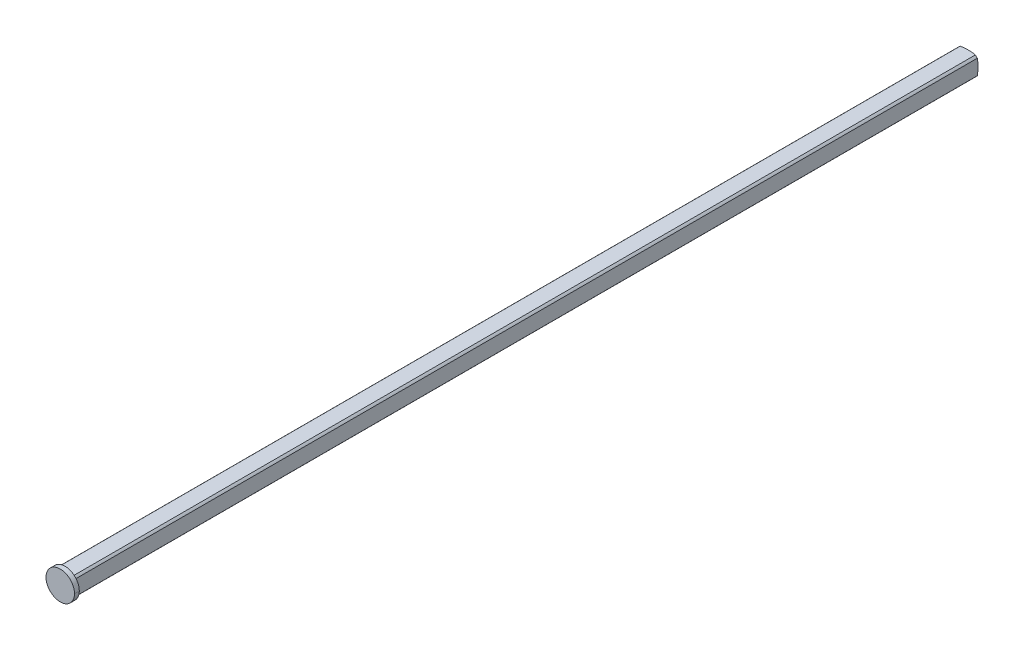
ISO-10303-21;
HEADER;
FILE_DESCRIPTION(('STEP AP214'),'2;1');
FILE_NAME('part.step','',(''),(''),'','','');
FILE_SCHEMA(('AUTOMOTIVE_DESIGN { 1 0 10303 214 1 1 1 1 }'));
ENDSEC;
DATA;
#1=APPLICATION_CONTEXT('core data for automotive mechanical design processes');
#2=APPLICATION_PROTOCOL_DEFINITION('international standard','automotive_design',2000,#1);
#3=PRODUCT_CONTEXT('',#1,'mechanical');
#4=PRODUCT('Part','Part','',(#3));
#5=PRODUCT_RELATED_PRODUCT_CATEGORY('part','',(#4));
#6=PRODUCT_DEFINITION_FORMATION('','',#4);
#7=PRODUCT_DEFINITION_CONTEXT('part definition',#1,'design');
#8=PRODUCT_DEFINITION('design','',#6,#7);
#9=PRODUCT_DEFINITION_SHAPE('','',#8);
#10=(LENGTH_UNIT() NAMED_UNIT(*) SI_UNIT(.MILLI.,.METRE.));
#11=(NAMED_UNIT(*) PLANE_ANGLE_UNIT() SI_UNIT($,.RADIAN.));
#12=(NAMED_UNIT(*) SI_UNIT($,.STERADIAN.) SOLID_ANGLE_UNIT());
#13=UNCERTAINTY_MEASURE_WITH_UNIT(LENGTH_MEASURE(1.E-05),#10,'distance_accuracy_value','');
#14=(GEOMETRIC_REPRESENTATION_CONTEXT(3) GLOBAL_UNCERTAINTY_ASSIGNED_CONTEXT((#13)) GLOBAL_UNIT_ASSIGNED_CONTEXT((#10,
#11,#12)) REPRESENTATION_CONTEXT('',''));
#15=CARTESIAN_POINT('',(0.,0.,0.));
#16=DIRECTION('',(0.,0.,1.));
#17=DIRECTION('',(1.,0.,0.));
#18=AXIS2_PLACEMENT_3D('',#15,#16,#17);
#19=CARTESIAN_POINT('',(0.,0.,-150.622));
#20=DIRECTION('',(0.,0.,1.));
#21=DIRECTION('',(1.,0.,0.));
#22=AXIS2_PLACEMENT_3D('',#19,#20,#21);
#23=CYLINDRICAL_SURFACE('',#22,2.032);
#24=DIRECTION('',(0.,0.,-1.));
#25=VECTOR('',#24,1.);
#26=CARTESIAN_POINT('',(1.5875,1.26841150657032,-150.622));
#27=LINE('',#26,#25);
#28=CARTESIAN_POINT('',(1.5875,1.26841150657032,0.));
#29=VERTEX_POINT('',#28);
#30=CARTESIAN_POINT('',(1.5875,1.26841150657033,-150.470919142098));
#31=VERTEX_POINT('',#30);
#32=EDGE_CURVE('P0_E292',#29,#31,#27,.T.);
#33=ORIENTED_EDGE('',*,*,#32,.T.);
#34=CARTESIAN_POINT('',(0.,0.,-150.470919142098));
#35=DIRECTION('',(0.,0.,1.));
#36=DIRECTION('',(1.,0.,0.));
#37=AXIS2_PLACEMENT_3D('',#34,#35,#36);
#38=CIRCLE('',#37,2.032);
#39=CARTESIAN_POINT('',(1.26841150657032,1.5875,-150.470919142098));
#40=VERTEX_POINT('',#39);
#41=EDGE_CURVE('P0_E370',#31,#40,#38,.T.);
#42=ORIENTED_EDGE('',*,*,#41,.T.);
#43=DIRECTION('',(0.,0.,1.));
#44=VECTOR('',#43,1.);
#45=CARTESIAN_POINT('',(1.26841150657032,1.5875,-150.622));
#46=LINE('',#45,#44);
#47=CARTESIAN_POINT('',(1.26841150657032,1.5875,0.));
#48=VERTEX_POINT('',#47);
#49=EDGE_CURVE('P0_E358',#40,#48,#46,.T.);
#50=ORIENTED_EDGE('',*,*,#49,.T.);
#51=CARTESIAN_POINT('',(0.,0.,0.));
#52=DIRECTION('',(0.,0.,1.));
#53=DIRECTION('',(1.,0.,0.));
#54=AXIS2_PLACEMENT_3D('',#51,#52,#53);
#55=CIRCLE('',#54,2.032);
#56=EDGE_CURVE('P0_E344',#29,#48,#55,.T.);
#57=ORIENTED_EDGE('',*,*,#56,.F.);
#58=EDGE_LOOP('',(#33,#42,#50,#57));
#59=FACE_BOUND('',#58,.T.);
#60=ADVANCED_FACE('P0_F17',(#59),#23,.T.);
#61=CARTESIAN_POINT('',(0.,0.,-150.622));
#62=DIRECTION('',(0.,0.,1.));
#63=DIRECTION('',(1.,0.,0.));
#64=AXIS2_PLACEMENT_3D('',#61,#62,#63);
#65=CYLINDRICAL_SURFACE('',#64,2.032);
#66=DIRECTION('',(0.,0.,1.));
#67=VECTOR('',#66,1.);
#68=CARTESIAN_POINT('',(-1.5875,1.26841150657032,-150.622));
#69=LINE('',#68,#67);
#70=CARTESIAN_POINT('',(-1.5875,1.26841150657032,-150.470919142098));
#71=VERTEX_POINT('',#70);
#72=CARTESIAN_POINT('',(-1.5875,1.26841150657032,0.));
#73=VERTEX_POINT('',#72);
#74=EDGE_CURVE('P0_E144',#71,#73,#69,.T.);
#75=ORIENTED_EDGE('',*,*,#74,.T.);
#76=CARTESIAN_POINT('',(0.,0.,0.));
#77=DIRECTION('',(0.,0.,1.));
#78=DIRECTION('',(1.,0.,0.));
#79=AXIS2_PLACEMENT_3D('',#76,#77,#78);
#80=CIRCLE('',#79,2.032);
#81=CARTESIAN_POINT('',(-1.26841150657032,1.5875,0.));
#82=VERTEX_POINT('',#81);
#83=EDGE_CURVE('P0_E43',#82,#73,#80,.T.);
#84=ORIENTED_EDGE('',*,*,#83,.F.);
#85=DIRECTION('',(0.,0.,-1.));
#86=VECTOR('',#85,1.);
#87=CARTESIAN_POINT('',(-1.26841150657032,1.5875,-150.622));
#88=LINE('',#87,#86);
#89=CARTESIAN_POINT('',(-1.26841150657033,1.5875,-150.470919142098));
#90=VERTEX_POINT('',#89);
#91=EDGE_CURVE('P0_E327',#82,#90,#88,.T.);
#92=ORIENTED_EDGE('',*,*,#91,.T.);
#93=CARTESIAN_POINT('',(0.,0.,-150.470919142098));
#94=DIRECTION('',(0.,0.,1.));
#95=DIRECTION('',(1.,0.,0.));
#96=AXIS2_PLACEMENT_3D('',#93,#94,#95);
#97=CIRCLE('',#96,2.032);
#98=EDGE_CURVE('P0_E274',#90,#71,#97,.T.);
#99=ORIENTED_EDGE('',*,*,#98,.T.);
#100=EDGE_LOOP('',(#75,#84,#92,#99));
#101=FACE_BOUND('',#100,.T.);
#102=ADVANCED_FACE('P0_F424',(#101),#65,.T.);
#103=CARTESIAN_POINT('',(0.,0.,-150.622));
#104=DIRECTION('',(0.,0.,1.));
#105=DIRECTION('',(1.,0.,0.));
#106=AXIS2_PLACEMENT_3D('',#103,#104,#105);
#107=CYLINDRICAL_SURFACE('',#106,2.032);
#108=DIRECTION('',(0.,0.,-1.));
#109=VECTOR('',#108,1.);
#110=CARTESIAN_POINT('',(-1.5875,-1.26841150657032,-150.622));
#111=LINE('',#110,#109);
#112=CARTESIAN_POINT('',(-1.5875,-1.26841150657032,0.));
#113=VERTEX_POINT('',#112);
#114=CARTESIAN_POINT('',(-1.5875,-1.26841150657033,-150.470919142098));
#115=VERTEX_POINT('',#114);
#116=EDGE_CURVE('P0_E117',#113,#115,#111,.T.);
#117=ORIENTED_EDGE('',*,*,#116,.T.);
#118=CARTESIAN_POINT('',(0.,0.,-150.470919142098));
#119=DIRECTION('',(0.,0.,1.));
#120=DIRECTION('',(1.,0.,0.));
#121=AXIS2_PLACEMENT_3D('',#118,#119,#120);
#122=CIRCLE('',#121,2.032);
#123=CARTESIAN_POINT('',(-1.26841150657032,-1.5875,-150.470919142098));
#124=VERTEX_POINT('',#123);
#125=EDGE_CURVE('P0_E11',#115,#124,#122,.T.);
#126=ORIENTED_EDGE('',*,*,#125,.T.);
#127=DIRECTION('',(0.,0.,1.));
#128=VECTOR('',#127,1.);
#129=CARTESIAN_POINT('',(-1.26841150657032,-1.5875,-150.622));
#130=LINE('',#129,#128);
#131=CARTESIAN_POINT('',(-1.26841150657032,-1.5875,0.));
#132=VERTEX_POINT('',#131);
#133=EDGE_CURVE('P0_E120',#124,#132,#130,.T.);
#134=ORIENTED_EDGE('',*,*,#133,.T.);
#135=CARTESIAN_POINT('',(0.,0.,0.));
#136=DIRECTION('',(0.,0.,1.));
#137=DIRECTION('',(1.,0.,0.));
#138=AXIS2_PLACEMENT_3D('',#135,#136,#137);
#139=CIRCLE('',#138,2.032);
#140=EDGE_CURVE('P0_E111',#113,#132,#139,.T.);
#141=ORIENTED_EDGE('',*,*,#140,.F.);
#142=EDGE_LOOP('',(#117,#126,#134,#141));
#143=FACE_BOUND('',#142,.T.);
#144=ADVANCED_FACE('P0_F19',(#143),#107,.T.);
#145=CARTESIAN_POINT('',(0.,0.,-150.622));
#146=DIRECTION('',(0.,0.,1.));
#147=DIRECTION('',(1.,0.,0.));
#148=AXIS2_PLACEMENT_3D('',#145,#146,#147);
#149=CYLINDRICAL_SURFACE('',#148,2.032);
#150=DIRECTION('',(0.,0.,-1.));
#151=VECTOR('',#150,1.);
#152=CARTESIAN_POINT('',(1.26841150657032,-1.5875,-150.622));
#153=LINE('',#152,#151);
#154=CARTESIAN_POINT('',(1.26841150657032,-1.5875,0.));
#155=VERTEX_POINT('',#154);
#156=CARTESIAN_POINT('',(1.26841150657033,-1.5875,-150.470919142098));
#157=VERTEX_POINT('',#156);
#158=EDGE_CURVE('P0_E237',#155,#157,#153,.T.);
#159=ORIENTED_EDGE('',*,*,#158,.T.);
#160=CARTESIAN_POINT('',(0.,0.,-150.470919142098));
#161=DIRECTION('',(0.,0.,1.));
#162=DIRECTION('',(1.,0.,0.));
#163=AXIS2_PLACEMENT_3D('',#160,#161,#162);
#164=CIRCLE('',#163,2.032);
#165=CARTESIAN_POINT('',(1.5875,-1.26841150657032,-150.470919142098));
#166=VERTEX_POINT('',#165);
#167=EDGE_CURVE('P0_E29',#157,#166,#164,.T.);
#168=ORIENTED_EDGE('',*,*,#167,.T.);
#169=DIRECTION('',(0.,0.,1.));
#170=VECTOR('',#169,1.);
#171=CARTESIAN_POINT('',(1.5875,-1.26841150657032,-150.622));
#172=LINE('',#171,#170);
#173=CARTESIAN_POINT('',(1.5875,-1.26841150657032,0.));
#174=VERTEX_POINT('',#173);
#175=EDGE_CURVE('P0_E284',#166,#174,#172,.T.);
#176=ORIENTED_EDGE('',*,*,#175,.T.);
#177=CARTESIAN_POINT('',(0.,0.,0.));
#178=DIRECTION('',(0.,0.,1.));
#179=DIRECTION('',(1.,0.,0.));
#180=AXIS2_PLACEMENT_3D('',#177,#178,#179);
#181=CIRCLE('',#180,2.032);
#182=EDGE_CURVE('P0_E123',#155,#174,#181,.T.);
#183=ORIENTED_EDGE('',*,*,#182,.F.);
#184=EDGE_LOOP('',(#159,#168,#176,#183));
#185=FACE_BOUND('',#184,.T.);
#186=ADVANCED_FACE('P0_F449',(#185),#149,.T.);
#187=CARTESIAN_POINT('',(-1.5875,1.5875,-150.622));
#188=DIRECTION('',(0.,0.,-1.));
#189=DIRECTION('',(0.,-1.,0.));
#190=AXIS2_PLACEMENT_3D('',#187,#188,#189);
#191=PLANE('',#190);
#192=CARTESIAN_POINT('',(0.,0.,-150.622));
#193=DIRECTION('',(0.,0.,1.));
#194=DIRECTION('',(1.,0.,0.));
#195=AXIS2_PLACEMENT_3D('',#192,#193,#194);
#196=CIRCLE('',#195,1.24506403026729);
#197=CARTESIAN_POINT('',(1.24506403026729,0.,-150.622));
#198=VERTEX_POINT('',#197);
#199=CARTESIAN_POINT('',(-1.24506403026729,0.,-150.622));
#200=VERTEX_POINT('',#199);
#201=EDGE_CURVE('P0_E266',#198,#200,#196,.T.);
#202=ORIENTED_EDGE('',*,*,#201,.F.);
#203=CARTESIAN_POINT('',(0.,0.,-150.622));
#204=DIRECTION('',(0.,0.,1.));
#205=DIRECTION('',(1.,0.,0.));
#206=AXIS2_PLACEMENT_3D('',#203,#204,#205);
#207=CIRCLE('',#206,1.24506403026729);
#208=EDGE_CURVE('P0_E334',#200,#198,#207,.T.);
#209=ORIENTED_EDGE('',*,*,#208,.F.);
#210=EDGE_LOOP('',(#202,#209));
#211=FACE_BOUND('',#210,.T.);
#212=ADVANCED_FACE('P0_F212',(#211),#191,.T.);
#213=CARTESIAN_POINT('',(0.,0.,-148.497));
#214=DIRECTION('',(0.,0.,1.));
#215=DIRECTION('',(1.,0.,0.));
#216=AXIS2_PLACEMENT_3D('',#213,#214,#215);
#217=DEGENERATE_TOROIDAL_SURFACE('',#216,1.24506403026729,2.125,.T.);
#218=CARTESIAN_POINT('',(-1.24506403026729,0.,-148.497));
#219=DIRECTION('',(0.,1.,0.));
#220=DIRECTION('',(-1.,0.,0.));
#221=AXIS2_PLACEMENT_3D('',#218,#219,#220);
#222=CIRCLE('',#221,2.125);
#223=CARTESIAN_POINT('',(-1.5875,0.,-150.594227361693));
#224=VERTEX_POINT('',#223);
#225=EDGE_CURVE('P0_E260',#200,#224,#222,.T.);
#226=ORIENTED_EDGE('',*,*,#225,.F.);
#227=ORIENTED_EDGE('',*,*,#208,.T.);
#228=CARTESIAN_POINT('',(1.24506403026729,0.,-148.497));
#229=DIRECTION('',(0.,-1.,0.));
#230=DIRECTION('',(0.,0.,-1.));
#231=AXIS2_PLACEMENT_3D('',#228,#229,#230);
#232=CIRCLE('',#231,2.125);
#233=CARTESIAN_POINT('',(1.5875,0.,-150.594227361693));
#234=VERTEX_POINT('',#233);
#235=EDGE_CURVE('P0_E298',#198,#234,#232,.T.);
#236=ORIENTED_EDGE('',*,*,#235,.T.);
#237=CARTESIAN_POINT('',(1.5875,-1.26841150657032,-150.470919142098));
#238=CARTESIAN_POINT('',(1.5875,-0.987077095009398,-150.540930639111));
#239=CARTESIAN_POINT('',(1.5875,-0.639530459017572,-150.570181953889));
#240=CARTESIAN_POINT('',(1.5875,-0.353837297660082,-150.594227361693));
#241=CARTESIAN_POINT('',(1.5875,0.,-150.594227361693));
#242=B_SPLINE_CURVE_WITH_KNOTS('',2,(#237,#238,#239,#240,#241),.UNSPECIFIED.,.F.,.F.,(3,2,3),
(0.,0.5,1.),.UNSPECIFIED.);
#243=EDGE_CURVE('P0_E197',#166,#234,#242,.T.);
#244=ORIENTED_EDGE('',*,*,#243,.F.);
#245=ORIENTED_EDGE('',*,*,#167,.F.);
#246=CARTESIAN_POINT('',(-1.26841150657032,-1.5875,-150.470919142098));
#247=CARTESIAN_POINT('',(-0.770338232116335,-1.5875,-150.594867205803));
#248=CARTESIAN_POINT('',(0.00849337593368006,-1.5875,-150.59422365179));
#249=CARTESIAN_POINT('',(0.77547099049197,-1.5875,-150.593589892815));
#250=CARTESIAN_POINT('',(1.26841150657033,-1.5875,-150.470919142098));
#251=B_SPLINE_CURVE_WITH_KNOTS('',2,(#246,#247,#248,#249,#250),.UNSPECIFIED.,.F.,.F.,(3,2,3),
(0.,0.5,1.),.UNSPECIFIED.);
#252=EDGE_CURVE('P0_E240',#124,#157,#251,.T.);
#253=ORIENTED_EDGE('',*,*,#252,.F.);
#254=ORIENTED_EDGE('',*,*,#125,.F.);
#255=CARTESIAN_POINT('',(-1.5875,0.,-150.594227361693));
#256=CARTESIAN_POINT('',(-1.5875,-0.353179957239934,-150.594227361693));
#257=CARTESIAN_POINT('',(-1.5875,-0.639529322286502,-150.57018204945));
#258=CARTESIAN_POINT('',(-1.5875,-0.986669843144542,-150.541031985805));
#259=CARTESIAN_POINT('',(-1.5875,-1.26841150657033,-150.470919142098));
#260=B_SPLINE_CURVE_WITH_KNOTS('',2,(#255,#256,#257,#258,#259),.UNSPECIFIED.,.F.,.F.,(3,2,3),
(0.,0.5,1.),.UNSPECIFIED.);
#261=EDGE_CURVE('P0_E136',#224,#115,#260,.T.);
#262=ORIENTED_EDGE('',*,*,#261,.F.);
#263=EDGE_LOOP('',(#226,#227,#236,#244,#245,#253,#254,#262));
#264=FACE_BOUND('',#263,.T.);
#265=ADVANCED_FACE('P0_F204',(#264),#217,.T.);
#266=CARTESIAN_POINT('',(-1.5875,1.5875,0.));
#267=DIRECTION('',(0.,0.,-1.));
#268=DIRECTION('',(0.,-1.,0.));
#269=AXIS2_PLACEMENT_3D('',#266,#267,#268);
#270=PLANE('',#269);
#271=ORIENTED_EDGE('',*,*,#83,.T.);
#272=DIRECTION('',(0.,-1.,0.));
#273=VECTOR('',#272,1.);
#274=CARTESIAN_POINT('',(-1.5875,-1.5875,0.));
#275=LINE('',#274,#273);
#276=EDGE_CURVE('P0_E128',#73,#113,#275,.T.);
#277=ORIENTED_EDGE('',*,*,#276,.T.);
#278=ORIENTED_EDGE('',*,*,#140,.T.);
#279=DIRECTION('',(1.,0.,0.));
#280=VECTOR('',#279,1.);
#281=CARTESIAN_POINT('',(-1.5875,-1.5875,0.));
#282=LINE('',#281,#280);
#283=EDGE_CURVE('P0_E242',#132,#155,#282,.T.);
#284=ORIENTED_EDGE('',*,*,#283,.T.);
#285=ORIENTED_EDGE('',*,*,#182,.T.);
#286=DIRECTION('',(0.,1.,0.));
#287=VECTOR('',#286,1.);
#288=CARTESIAN_POINT('',(1.5875,-1.5875,0.));
#289=LINE('',#288,#287);
#290=EDGE_CURVE('P0_E353',#174,#29,#289,.T.);
#291=ORIENTED_EDGE('',*,*,#290,.T.);
#292=ORIENTED_EDGE('',*,*,#56,.T.);
#293=DIRECTION('',(-1.,0.,0.));
#294=VECTOR('',#293,1.);
#295=CARTESIAN_POINT('',(-1.5875,1.5875,0.));
#296=LINE('',#295,#294);
#297=EDGE_CURVE('P0_E324',#48,#82,#296,.T.);
#298=ORIENTED_EDGE('',*,*,#297,.T.);
#299=EDGE_LOOP('',(#271,#277,#278,#284,#285,#291,#292,#298));
#300=FACE_BOUND('',#299,.T.);
#301=ADVANCED_FACE('P0_F127',(#300),#270,.F.);
#302=CARTESIAN_POINT('',(-1.5875,1.5875,0.));
#303=DIRECTION('',(0.,-1.,0.));
#304=DIRECTION('',(0.,0.,-1.));
#305=AXIS2_PLACEMENT_3D('',#302,#303,#304);
#306=PLANE('',#305);
#307=ORIENTED_EDGE('',*,*,#49,.F.);
#308=CARTESIAN_POINT('',(1.26841150657033,1.5875,-150.470919142098));
#309=CARTESIAN_POINT('',(0.770338232116335,1.5875,-150.594867205803));
#310=CARTESIAN_POINT('',(-0.00849337593367486,1.5875,-150.59422365179));
#311=CARTESIAN_POINT('',(-0.775470990491971,1.5875,-150.593589892815));
#312=CARTESIAN_POINT('',(-1.26841150657033,1.5875,-150.470919142098));
#313=B_SPLINE_CURVE_WITH_KNOTS('',2,(#308,#309,#310,#311,#312),.UNSPECIFIED.,.F.,.F.,(3,2,3),
(0.,0.5,1.),.UNSPECIFIED.);
#314=EDGE_CURVE('P0_E586',#40,#90,#313,.T.);
#315=ORIENTED_EDGE('',*,*,#314,.T.);
#316=ORIENTED_EDGE('',*,*,#91,.F.);
#317=ORIENTED_EDGE('',*,*,#297,.F.);
#318=EDGE_LOOP('',(#307,#315,#316,#317));
#319=FACE_BOUND('',#318,.T.);
#320=ADVANCED_FACE('P0_F175',(#319),#306,.F.);
#321=CARTESIAN_POINT('',(1.5875,-1.5875,0.));
#322=DIRECTION('',(-1.,0.,0.));
#323=DIRECTION('',(0.,0.,1.));
#324=AXIS2_PLACEMENT_3D('',#321,#322,#323);
#325=PLANE('',#324);
#326=ORIENTED_EDGE('',*,*,#175,.F.);
#327=ORIENTED_EDGE('',*,*,#243,.T.);
#328=CARTESIAN_POINT('',(1.5875,0.,-150.594227361693));
#329=CARTESIAN_POINT('',(1.5875,0.353179957239905,-150.594227361693));
#330=CARTESIAN_POINT('',(1.5875,0.6395293222865,-150.57018204945));
#331=CARTESIAN_POINT('',(1.5875,0.986669843144525,-150.541031985805));
#332=CARTESIAN_POINT('',(1.5875,1.26841150657033,-150.470919142098));
#333=B_SPLINE_CURVE_WITH_KNOTS('',2,(#328,#329,#330,#331,#332),.UNSPECIFIED.,.F.,.F.,(3,2,3),
(0.,0.5,1.),.UNSPECIFIED.);
#334=EDGE_CURVE('P0_E160',#234,#31,#333,.T.);
#335=ORIENTED_EDGE('',*,*,#334,.T.);
#336=ORIENTED_EDGE('',*,*,#32,.F.);
#337=ORIENTED_EDGE('',*,*,#290,.F.);
#338=EDGE_LOOP('',(#326,#327,#335,#336,#337));
#339=FACE_BOUND('',#338,.T.);
#340=ADVANCED_FACE('P0_F163',(#339),#325,.F.);
#341=CARTESIAN_POINT('',(-1.5875,-1.5875,0.));
#342=DIRECTION('',(0.,1.,0.));
#343=DIRECTION('',(1.,0.,0.));
#344=AXIS2_PLACEMENT_3D('',#341,#342,#343);
#345=PLANE('',#344);
#346=ORIENTED_EDGE('',*,*,#133,.F.);
#347=ORIENTED_EDGE('',*,*,#252,.T.);
#348=ORIENTED_EDGE('',*,*,#158,.F.);
#349=ORIENTED_EDGE('',*,*,#283,.F.);
#350=EDGE_LOOP('',(#346,#347,#348,#349));
#351=FACE_BOUND('',#350,.T.);
#352=ADVANCED_FACE('P0_F173',(#351),#345,.F.);
#353=CARTESIAN_POINT('',(-1.5875,-1.5875,0.));
#354=DIRECTION('',(1.,0.,0.));
#355=DIRECTION('',(0.,1.,0.));
#356=AXIS2_PLACEMENT_3D('',#353,#354,#355);
#357=PLANE('',#356);
#358=ORIENTED_EDGE('',*,*,#74,.F.);
#359=CARTESIAN_POINT('',(-1.5875,1.26841150657033,-150.470919142098));
#360=CARTESIAN_POINT('',(-1.5875,0.9870770950094,-150.540930639111));
#361=CARTESIAN_POINT('',(-1.5875,0.639530459017575,-150.570181953889));
#362=CARTESIAN_POINT('',(-1.5875,0.353837297660085,-150.594227361693));
#363=CARTESIAN_POINT('',(-1.5875,0.,-150.594227361693));
#364=B_SPLINE_CURVE_WITH_KNOTS('',2,(#359,#360,#361,#362,#363),.UNSPECIFIED.,.F.,.F.,(3,2,3),
(0.,0.5,1.),.UNSPECIFIED.);
#365=EDGE_CURVE('P0_E264',#71,#224,#364,.T.);
#366=ORIENTED_EDGE('',*,*,#365,.T.);
#367=ORIENTED_EDGE('',*,*,#261,.T.);
#368=ORIENTED_EDGE('',*,*,#116,.F.);
#369=ORIENTED_EDGE('',*,*,#276,.F.);
#370=EDGE_LOOP('',(#358,#366,#367,#368,#369));
#371=FACE_BOUND('',#370,.T.);
#372=ADVANCED_FACE('P0_F133',(#371),#357,.F.);
#373=CARTESIAN_POINT('',(0.,0.,-148.497));
#374=DIRECTION('',(0.,0.,1.));
#375=DIRECTION('',(1.,0.,0.));
#376=AXIS2_PLACEMENT_3D('',#373,#374,#375);
#377=DEGENERATE_TOROIDAL_SURFACE('',#376,1.24506403026729,2.125,.T.);
#378=ORIENTED_EDGE('',*,*,#201,.T.);
#379=ORIENTED_EDGE('',*,*,#225,.T.);
#380=ORIENTED_EDGE('',*,*,#365,.F.);
#381=ORIENTED_EDGE('',*,*,#98,.F.);
#382=ORIENTED_EDGE('',*,*,#314,.F.);
#383=ORIENTED_EDGE('',*,*,#41,.F.);
#384=ORIENTED_EDGE('',*,*,#334,.F.);
#385=ORIENTED_EDGE('',*,*,#235,.F.);
#386=EDGE_LOOP('',(#378,#379,#380,#381,#382,#383,#384,#385));
#387=FACE_BOUND('',#386,.T.);
#388=ADVANCED_FACE('P0_F396',(#387),#377,.T.);
#389=CLOSED_SHELL('',(#60,#102,#144,#186,#212,#265,#301,#320,#340,#352,#372,#388));
#390=MANIFOLD_SOLID_BREP('P0_B1',#389);
#391=CARTESIAN_POINT('',(0.,0.,0.));
#392=DIRECTION('',(0.,0.,1.));
#393=DIRECTION('',(1.,0.,0.));
#394=AXIS2_PLACEMENT_3D('',#391,#392,#393);
#395=PLANE('',#394);
#396=CARTESIAN_POINT('',(0.,0.,0.));
#397=DIRECTION('',(0.,0.,1.));
#398=DIRECTION('',(1.,0.,0.));
#399=AXIS2_PLACEMENT_3D('',#396,#397,#398);
#400=CIRCLE('',#399,2.375);
#401=CARTESIAN_POINT('',(-2.375,0.,0.));
#402=VERTEX_POINT('',#401);
#403=CARTESIAN_POINT('',(2.375,0.,0.));
#404=VERTEX_POINT('',#403);
#405=EDGE_CURVE('P1_E10',#402,#404,#400,.T.);
#406=ORIENTED_EDGE('',*,*,#405,.F.);
#407=CARTESIAN_POINT('',(0.,0.,0.));
#408=DIRECTION('',(0.,0.,1.));
#409=DIRECTION('',(1.,0.,0.));
#410=AXIS2_PLACEMENT_3D('',#407,#408,#409);
#411=CIRCLE('',#410,2.375);
#412=EDGE_CURVE('P1_E65',#404,#402,#411,.T.);
#413=ORIENTED_EDGE('',*,*,#412,.F.);
#414=EDGE_LOOP('',(#406,#413));
#415=FACE_BOUND('',#414,.T.);
#416=ADVANCED_FACE('P1_F16',(#415),#395,.F.);
#417=CARTESIAN_POINT('',(0.,0.,0.8));
#418=DIRECTION('',(0.,0.,1.));
#419=DIRECTION('',(1.,0.,0.));
#420=AXIS2_PLACEMENT_3D('',#417,#418,#419);
#421=PLANE('',#420);
#422=CARTESIAN_POINT('',(0.,0.,0.8));
#423=DIRECTION('',(0.,0.,1.));
#424=DIRECTION('',(1.,0.,0.));
#425=AXIS2_PLACEMENT_3D('',#422,#423,#424);
#426=CIRCLE('',#425,2.375);
#427=CARTESIAN_POINT('',(-2.375,0.,0.8));
#428=VERTEX_POINT('',#427);
#429=CARTESIAN_POINT('',(2.375,0.,0.8));
#430=VERTEX_POINT('',#429);
#431=EDGE_CURVE('P1_E27',#428,#430,#426,.T.);
#432=ORIENTED_EDGE('',*,*,#431,.T.);
#433=CARTESIAN_POINT('',(0.,0.,0.8));
#434=DIRECTION('',(0.,0.,1.));
#435=DIRECTION('',(1.,0.,0.));
#436=AXIS2_PLACEMENT_3D('',#433,#434,#435);
#437=CIRCLE('',#436,2.375);
#438=EDGE_CURVE('P1_E60',#430,#428,#437,.T.);
#439=ORIENTED_EDGE('',*,*,#438,.T.);
#440=EDGE_LOOP('',(#432,#439));
#441=FACE_BOUND('',#440,.T.);
#442=ADVANCED_FACE('P1_F54',(#441),#421,.T.);
#443=CARTESIAN_POINT('',(0.,0.,0.8));
#444=DIRECTION('',(0.,0.,-1.));
#445=DIRECTION('',(-1.,0.,0.));
#446=AXIS2_PLACEMENT_3D('',#443,#444,#445);
#447=CYLINDRICAL_SURFACE('',#446,2.375);
#448=DIRECTION('',(0.,0.,-1.));
#449=VECTOR('',#448,1.);
#450=CARTESIAN_POINT('',(2.375,0.,0.8));
#451=LINE('',#450,#449);
#452=EDGE_CURVE('P1_E19',#430,#404,#451,.T.);
#453=ORIENTED_EDGE('',*,*,#452,.F.);
#454=ORIENTED_EDGE('',*,*,#431,.F.);
#455=DIRECTION('',(0.,0.,-1.));
#456=VECTOR('',#455,1.);
#457=CARTESIAN_POINT('',(-2.375,0.,0.8));
#458=LINE('',#457,#456);
#459=EDGE_CURVE('P1_E56',#428,#402,#458,.T.);
#460=ORIENTED_EDGE('',*,*,#459,.T.);
#461=ORIENTED_EDGE('',*,*,#405,.T.);
#462=EDGE_LOOP('',(#453,#454,#460,#461));
#463=FACE_BOUND('',#462,.T.);
#464=ADVANCED_FACE('P1_F61',(#463),#447,.T.);
#465=CARTESIAN_POINT('',(0.,0.,0.8));
#466=DIRECTION('',(0.,0.,-1.));
#467=DIRECTION('',(-1.,0.,0.));
#468=AXIS2_PLACEMENT_3D('',#465,#466,#467);
#469=CYLINDRICAL_SURFACE('',#468,2.375);
#470=ORIENTED_EDGE('',*,*,#438,.F.);
#471=ORIENTED_EDGE('',*,*,#452,.T.);
#472=ORIENTED_EDGE('',*,*,#412,.T.);
#473=ORIENTED_EDGE('',*,*,#459,.F.);
#474=EDGE_LOOP('',(#470,#471,#472,#473));
#475=FACE_BOUND('',#474,.T.);
#476=ADVANCED_FACE('P1_F66',(#475),#469,.T.);
#477=CLOSED_SHELL('',(#416,#442,#464,#476));
#478=MANIFOLD_SOLID_BREP('P1_B1',#477);
#479=ADVANCED_BREP_SHAPE_REPRESENTATION('',(#18,#390,#478),#14);
#480=SHAPE_DEFINITION_REPRESENTATION(#9,#479);
ENDSEC;
END-ISO-10303-21;
